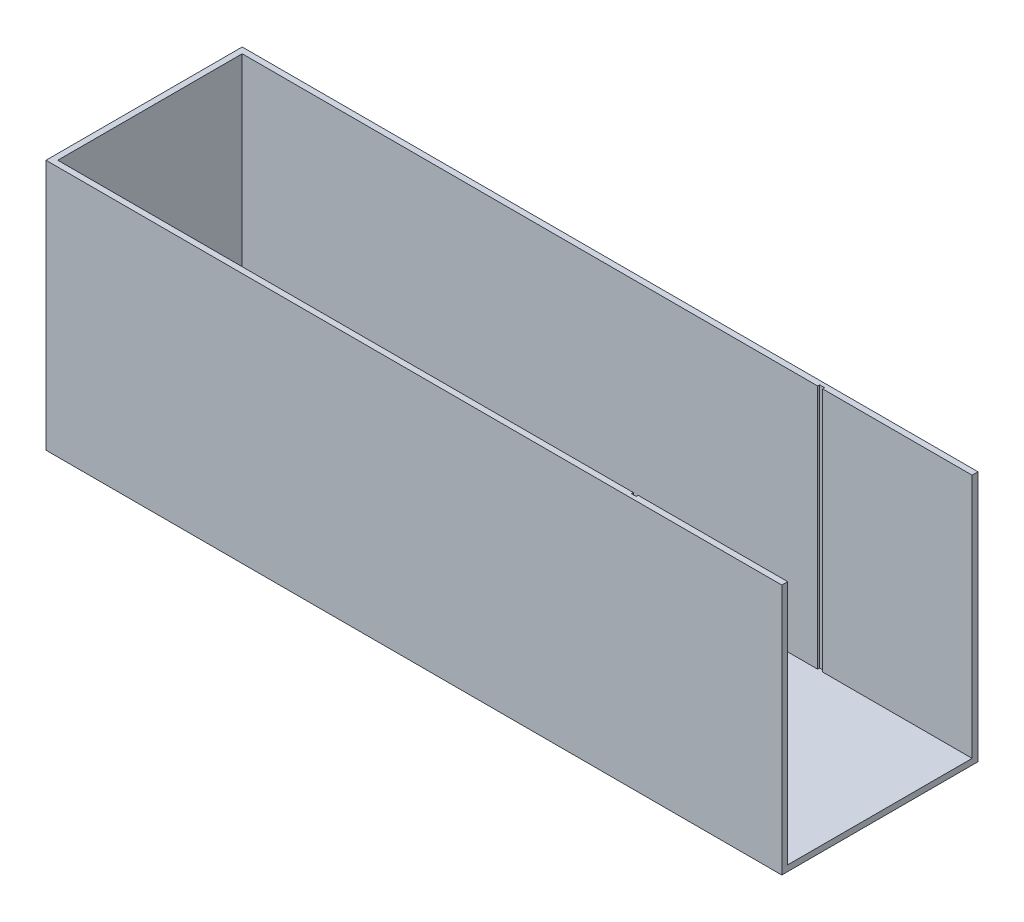
ISO-10303-21;
HEADER;
FILE_DESCRIPTION(('STEP AP214'),'2;1');
FILE_NAME('part.step','',(''),(''),'','','');
FILE_SCHEMA(('AUTOMOTIVE_DESIGN { 1 0 10303 214 1 1 1 1 }'));
ENDSEC;
DATA;
#1=APPLICATION_CONTEXT('core data for automotive mechanical design processes');
#2=APPLICATION_PROTOCOL_DEFINITION('international standard','automotive_design',2000,#1);
#3=PRODUCT_CONTEXT('',#1,'mechanical');
#4=PRODUCT('Part','Part','',(#3));
#5=PRODUCT_RELATED_PRODUCT_CATEGORY('part','',(#4));
#6=PRODUCT_DEFINITION_FORMATION('','',#4);
#7=PRODUCT_DEFINITION_CONTEXT('part definition',#1,'design');
#8=PRODUCT_DEFINITION('design','',#6,#7);
#9=PRODUCT_DEFINITION_SHAPE('','',#8);
#10=(LENGTH_UNIT() NAMED_UNIT(*) SI_UNIT(.MILLI.,.METRE.));
#11=(NAMED_UNIT(*) PLANE_ANGLE_UNIT() SI_UNIT($,.RADIAN.));
#12=(NAMED_UNIT(*) SI_UNIT($,.STERADIAN.) SOLID_ANGLE_UNIT());
#13=UNCERTAINTY_MEASURE_WITH_UNIT(LENGTH_MEASURE(1.E-05),#10,'distance_accuracy_value','');
#14=(GEOMETRIC_REPRESENTATION_CONTEXT(3) GLOBAL_UNCERTAINTY_ASSIGNED_CONTEXT((#13)) GLOBAL_UNIT_ASSIGNED_CONTEXT((#10,
#11,#12)) REPRESENTATION_CONTEXT('',''));
#15=CARTESIAN_POINT('',(0.,0.,0.));
#16=DIRECTION('',(0.,0.,1.));
#17=DIRECTION('',(1.,0.,0.));
#18=AXIS2_PLACEMENT_3D('',#15,#16,#17);
#19=CARTESIAN_POINT('',(-738.,506.,188.));
#20=DIRECTION('',(0.,0.,1.));
#21=DIRECTION('',(1.,0.,0.));
#22=AXIS2_PLACEMENT_3D('',#19,#20,#21);
#23=PLANE('',#22);
#24=DIRECTION('',(0.,-1.,0.));
#25=VECTOR('',#24,1.);
#26=CARTESIAN_POINT('',(435.2,506.,187.999999999998));
#27=LINE('',#26,#25);
#28=CARTESIAN_POINT('',(435.2,506.,187.999999999998));
#29=VERTEX_POINT('',#28);
#30=CARTESIAN_POINT('',(435.2,6.,187.999999999998));
#31=VERTEX_POINT('',#30);
#32=EDGE_CURVE('E289',#29,#31,#27,.T.);
#33=ORIENTED_EDGE('',*,*,#32,.T.);
#34=DIRECTION('',(-1.,0.,0.));
#35=VECTOR('',#34,1.);
#36=CARTESIAN_POINT('',(-738.,6.,188.));
#37=LINE('',#36,#35);
#38=CARTESIAN_POINT('',(-738.,6.,188.));
#39=VERTEX_POINT('',#38);
#40=EDGE_CURVE('E223',#31,#39,#37,.T.);
#41=ORIENTED_EDGE('',*,*,#40,.T.);
#42=DIRECTION('',(0.,-1.,0.));
#43=VECTOR('',#42,1.);
#44=CARTESIAN_POINT('',(-738.,506.,188.));
#45=LINE('',#44,#43);
#46=CARTESIAN_POINT('',(-738.,506.,188.));
#47=VERTEX_POINT('',#46);
#48=EDGE_CURVE('E232',#47,#39,#45,.T.);
#49=ORIENTED_EDGE('',*,*,#48,.F.);
#50=DIRECTION('',(-1.,0.,0.));
#51=VECTOR('',#50,1.);
#52=CARTESIAN_POINT('',(738.,506.,188.));
#53=LINE('',#52,#51);
#54=EDGE_CURVE('E215',#29,#47,#53,.T.);
#55=ORIENTED_EDGE('',*,*,#54,.F.);
#56=EDGE_LOOP('',(#33,#41,#49,#55));
#57=FACE_BOUND('',#56,.T.);
#58=ADVANCED_FACE('F32',(#57),#23,.F.);
#59=DIRECTION('',(0.,1.,0.));
#60=VECTOR('',#59,1.);
#61=CARTESIAN_POINT('',(445.2,506.,187.999999999998));
#62=LINE('',#61,#60);
#63=CARTESIAN_POINT('',(445.2,6.,187.999999999998));
#64=VERTEX_POINT('',#63);
#65=CARTESIAN_POINT('',(445.2,506.,187.999999999998));
#66=VERTEX_POINT('',#65);
#67=EDGE_CURVE('E288',#64,#66,#62,.T.);
#68=ORIENTED_EDGE('',*,*,#67,.T.);
#69=CARTESIAN_POINT('',(750.,506.,188.));
#70=VERTEX_POINT('',#69);
#71=EDGE_CURVE('E166',#70,#66,#53,.T.);
#72=ORIENTED_EDGE('',*,*,#71,.F.);
#73=DIRECTION('',(0.,-1.,0.));
#74=VECTOR('',#73,1.);
#75=CARTESIAN_POINT('',(750.,506.,188.));
#76=LINE('',#75,#74);
#77=CARTESIAN_POINT('',(750.,6.,188.));
#78=VERTEX_POINT('',#77);
#79=EDGE_CURVE('E235',#70,#78,#76,.T.);
#80=ORIENTED_EDGE('',*,*,#79,.T.);
#81=EDGE_CURVE('E224',#78,#64,#37,.T.);
#82=ORIENTED_EDGE('',*,*,#81,.T.);
#83=EDGE_LOOP('',(#68,#72,#80,#82));
#84=FACE_BOUND('',#83,.T.);
#85=ADVANCED_FACE('F287',(#84),#23,.F.);
#86=CARTESIAN_POINT('',(0.,506.,0.));
#87=DIRECTION('',(0.,1.,0.));
#88=DIRECTION('',(0.,0.,1.));
#89=AXIS2_PLACEMENT_3D('',#86,#87,#88);
#90=PLANE('',#89);
#91=DIRECTION('',(-1.,0.,0.));
#92=VECTOR('',#91,1.);
#93=CARTESIAN_POINT('',(435.2,506.,191.999999999998));
#94=LINE('',#93,#92);
#95=CARTESIAN_POINT('',(445.2,506.,191.999999999998));
#96=VERTEX_POINT('',#95);
#97=CARTESIAN_POINT('',(435.2,506.,191.999999999998));
#98=VERTEX_POINT('',#97);
#99=EDGE_CURVE('E156',#96,#98,#94,.T.);
#100=ORIENTED_EDGE('',*,*,#99,.T.);
#101=DIRECTION('',(0.,0.,-1.));
#102=VECTOR('',#101,1.);
#103=CARTESIAN_POINT('',(435.2,506.,191.999999999998));
#104=LINE('',#103,#102);
#105=EDGE_CURVE('E167',#98,#29,#104,.T.);
#106=ORIENTED_EDGE('',*,*,#105,.T.);
#107=ORIENTED_EDGE('',*,*,#54,.T.);
#108=DIRECTION('',(0.,0.,-1.));
#109=VECTOR('',#108,1.);
#110=CARTESIAN_POINT('',(-738.,506.,-188.));
#111=LINE('',#110,#109);
#112=CARTESIAN_POINT('',(-738.,506.,-188.));
#113=VERTEX_POINT('',#112);
#114=EDGE_CURVE('E217',#47,#113,#111,.T.);
#115=ORIENTED_EDGE('',*,*,#114,.T.);
#116=DIRECTION('',(1.,0.,0.));
#117=VECTOR('',#116,1.);
#118=CARTESIAN_POINT('',(738.,506.,-188.));
#119=LINE('',#118,#117);
#120=CARTESIAN_POINT('',(435.2,506.,-187.999999999998));
#121=VERTEX_POINT('',#120);
#122=EDGE_CURVE('E197',#113,#121,#119,.T.);
#123=ORIENTED_EDGE('',*,*,#122,.T.);
#124=DIRECTION('',(0.,0.,1.));
#125=VECTOR('',#124,1.);
#126=CARTESIAN_POINT('',(435.2,506.,-191.999999999998));
#127=LINE('',#126,#125);
#128=CARTESIAN_POINT('',(435.2,506.,-191.999999999998));
#129=VERTEX_POINT('',#128);
#130=EDGE_CURVE('E188',#129,#121,#127,.T.);
#131=ORIENTED_EDGE('',*,*,#130,.F.);
#132=DIRECTION('',(-1.,0.,0.));
#133=VECTOR('',#132,1.);
#134=CARTESIAN_POINT('',(435.2,506.,-191.999999999998));
#135=LINE('',#134,#133);
#136=CARTESIAN_POINT('',(445.2,506.,-191.999999999998));
#137=VERTEX_POINT('',#136);
#138=EDGE_CURVE('E181',#137,#129,#135,.T.);
#139=ORIENTED_EDGE('',*,*,#138,.F.);
#140=DIRECTION('',(0.,0.,1.));
#141=VECTOR('',#140,1.);
#142=CARTESIAN_POINT('',(445.2,506.,-191.999999999998));
#143=LINE('',#142,#141);
#144=CARTESIAN_POINT('',(445.2,506.,-187.999999999998));
#145=VERTEX_POINT('',#144);
#146=EDGE_CURVE('E191',#137,#145,#143,.T.);
#147=ORIENTED_EDGE('',*,*,#146,.T.);
#148=CARTESIAN_POINT('',(750.,506.,-188.));
#149=VERTEX_POINT('',#148);
#150=EDGE_CURVE('E201',#145,#149,#119,.T.);
#151=ORIENTED_EDGE('',*,*,#150,.T.);
#152=DIRECTION('',(0.,0.,-1.));
#153=VECTOR('',#152,1.);
#154=CARTESIAN_POINT('',(750.,506.,-188.));
#155=LINE('',#154,#153);
#156=CARTESIAN_POINT('',(750.,506.,-200.));
#157=VERTEX_POINT('',#156);
#158=EDGE_CURVE('E200',#149,#157,#155,.T.);
#159=ORIENTED_EDGE('',*,*,#158,.T.);
#160=DIRECTION('',(-1.,0.,0.));
#161=VECTOR('',#160,1.);
#162=CARTESIAN_POINT('',(750.,506.,-200.));
#163=LINE('',#162,#161);
#164=CARTESIAN_POINT('',(-750.,506.,-200.));
#165=VERTEX_POINT('',#164);
#166=EDGE_CURVE('E204',#157,#165,#163,.T.);
#167=ORIENTED_EDGE('',*,*,#166,.T.);
#168=DIRECTION('',(0.,0.,1.));
#169=VECTOR('',#168,1.);
#170=CARTESIAN_POINT('',(-750.,506.,-200.));
#171=LINE('',#170,#169);
#172=CARTESIAN_POINT('',(-750.,506.,200.));
#173=VERTEX_POINT('',#172);
#174=EDGE_CURVE('E207',#165,#173,#171,.T.);
#175=ORIENTED_EDGE('',*,*,#174,.T.);
#176=DIRECTION('',(1.,0.,0.));
#177=VECTOR('',#176,1.);
#178=CARTESIAN_POINT('',(-750.,506.,200.));
#179=LINE('',#178,#177);
#180=CARTESIAN_POINT('',(750.,506.,200.));
#181=VERTEX_POINT('',#180);
#182=EDGE_CURVE('E210',#173,#181,#179,.T.);
#183=ORIENTED_EDGE('',*,*,#182,.T.);
#184=DIRECTION('',(0.,0.,-1.));
#185=VECTOR('',#184,1.);
#186=CARTESIAN_POINT('',(750.,506.,188.));
#187=LINE('',#186,#185);
#188=EDGE_CURVE('E213',#181,#70,#187,.T.);
#189=ORIENTED_EDGE('',*,*,#188,.T.);
#190=ORIENTED_EDGE('',*,*,#71,.T.);
#191=DIRECTION('',(0.,0.,-1.));
#192=VECTOR('',#191,1.);
#193=CARTESIAN_POINT('',(445.2,506.,191.999999999998));
#194=LINE('',#193,#192);
#195=EDGE_CURVE('E152',#96,#66,#194,.T.);
#196=ORIENTED_EDGE('',*,*,#195,.F.);
#197=EDGE_LOOP('',(#100,#106,#107,#115,#123,#131,#139,#147,#151,#159,#167,#175,#183,#189,#190,#196));
#198=FACE_BOUND('',#197,.T.);
#199=ADVANCED_FACE('F164',(#198),#90,.T.);
#200=CARTESIAN_POINT('',(738.,506.,-188.));
#201=DIRECTION('',(0.,0.,-1.));
#202=DIRECTION('',(-1.,0.,0.));
#203=AXIS2_PLACEMENT_3D('',#200,#201,#202);
#204=PLANE('',#203);
#205=DIRECTION('',(1.,0.,0.));
#206=VECTOR('',#205,1.);
#207=CARTESIAN_POINT('',(738.,6.,-188.));
#208=LINE('',#207,#206);
#209=CARTESIAN_POINT('',(-738.,6.,-188.));
#210=VERTEX_POINT('',#209);
#211=CARTESIAN_POINT('',(435.2,6.,-187.999999999998));
#212=VERTEX_POINT('',#211);
#213=EDGE_CURVE('E220',#210,#212,#208,.T.);
#214=ORIENTED_EDGE('',*,*,#213,.T.);
#215=DIRECTION('',(0.,-1.,0.));
#216=VECTOR('',#215,1.);
#217=CARTESIAN_POINT('',(435.2,506.,-187.999999999998));
#218=LINE('',#217,#216);
#219=EDGE_CURVE('E184',#121,#212,#218,.T.);
#220=ORIENTED_EDGE('',*,*,#219,.F.);
#221=ORIENTED_EDGE('',*,*,#122,.F.);
#222=DIRECTION('',(0.,-1.,0.));
#223=VECTOR('',#222,1.);
#224=CARTESIAN_POINT('',(-738.,506.,-188.));
#225=LINE('',#224,#223);
#226=EDGE_CURVE('E219',#113,#210,#225,.T.);
#227=ORIENTED_EDGE('',*,*,#226,.T.);
#228=EDGE_LOOP('',(#214,#220,#221,#227));
#229=FACE_BOUND('',#228,.T.);
#230=ADVANCED_FACE('F312',(#229),#204,.F.);
#231=CARTESIAN_POINT('',(0.,6.,0.));
#232=DIRECTION('',(0.,-1.,0.));
#233=DIRECTION('',(0.,0.,-1.));
#234=AXIS2_PLACEMENT_3D('',#231,#232,#233);
#235=PLANE('',#234);
#236=ORIENTED_EDGE('',*,*,#213,.F.);
#237=DIRECTION('',(0.,0.,-1.));
#238=VECTOR('',#237,1.);
#239=CARTESIAN_POINT('',(-738.,6.,-188.));
#240=LINE('',#239,#238);
#241=EDGE_CURVE('E227',#39,#210,#240,.T.);
#242=ORIENTED_EDGE('',*,*,#241,.F.);
#243=ORIENTED_EDGE('',*,*,#40,.F.);
#244=DIRECTION('',(0.,0.,-1.));
#245=VECTOR('',#244,1.);
#246=CARTESIAN_POINT('',(435.2,6.,191.999999999998));
#247=LINE('',#246,#245);
#248=CARTESIAN_POINT('',(435.2,6.,191.999999999998));
#249=VERTEX_POINT('',#248);
#250=EDGE_CURVE('E169',#249,#31,#247,.T.);
#251=ORIENTED_EDGE('',*,*,#250,.F.);
#252=DIRECTION('',(1.,0.,0.));
#253=VECTOR('',#252,1.);
#254=CARTESIAN_POINT('',(435.2,6.,191.999999999998));
#255=LINE('',#254,#253);
#256=CARTESIAN_POINT('',(445.2,6.,191.999999999998));
#257=VERTEX_POINT('',#256);
#258=EDGE_CURVE('E155',#249,#257,#255,.T.);
#259=ORIENTED_EDGE('',*,*,#258,.T.);
#260=DIRECTION('',(0.,0.,-1.));
#261=VECTOR('',#260,1.);
#262=CARTESIAN_POINT('',(445.2,6.,191.999999999998));
#263=LINE('',#262,#261);
#264=EDGE_CURVE('E154',#257,#64,#263,.T.);
#265=ORIENTED_EDGE('',*,*,#264,.T.);
#266=ORIENTED_EDGE('',*,*,#81,.F.);
#267=DIRECTION('',(0.,0.,-1.));
#268=VECTOR('',#267,1.);
#269=CARTESIAN_POINT('',(750.,6.,200.));
#270=LINE('',#269,#268);
#271=CARTESIAN_POINT('',(750.,6.,-188.));
#272=VERTEX_POINT('',#271);
#273=EDGE_CURVE('E242',#78,#272,#270,.T.);
#274=ORIENTED_EDGE('',*,*,#273,.T.);
#275=CARTESIAN_POINT('',(445.2,6.,-187.999999999998));
#276=VERTEX_POINT('',#275);
#277=EDGE_CURVE('E190',#276,#272,#208,.T.);
#278=ORIENTED_EDGE('',*,*,#277,.F.);
#279=DIRECTION('',(0.,0.,1.));
#280=VECTOR('',#279,1.);
#281=CARTESIAN_POINT('',(445.2,6.,-191.999999999998));
#282=LINE('',#281,#280);
#283=CARTESIAN_POINT('',(445.2,6.,-191.999999999998));
#284=VERTEX_POINT('',#283);
#285=EDGE_CURVE('E194',#284,#276,#282,.T.);
#286=ORIENTED_EDGE('',*,*,#285,.F.);
#287=DIRECTION('',(1.,0.,0.));
#288=VECTOR('',#287,1.);
#289=CARTESIAN_POINT('',(435.2,6.,-191.999999999998));
#290=LINE('',#289,#288);
#291=CARTESIAN_POINT('',(435.2,6.,-191.999999999998));
#292=VERTEX_POINT('',#291);
#293=EDGE_CURVE('E177',#292,#284,#290,.T.);
#294=ORIENTED_EDGE('',*,*,#293,.F.);
#295=DIRECTION('',(0.,0.,1.));
#296=VECTOR('',#295,1.);
#297=CARTESIAN_POINT('',(435.2,6.,-191.999999999998));
#298=LINE('',#297,#296);
#299=EDGE_CURVE('E183',#292,#212,#298,.T.);
#300=ORIENTED_EDGE('',*,*,#299,.T.);
#301=EDGE_LOOP('',(#236,#242,#243,#251,#259,#265,#266,#274,#278,#286,#294,#300));
#302=FACE_BOUND('',#301,.T.);
#303=ADVANCED_FACE('F285',(#302),#235,.F.);
#304=CARTESIAN_POINT('',(750.,6.,200.));
#305=DIRECTION('',(-1.,0.,0.));
#306=DIRECTION('',(0.,0.,1.));
#307=AXIS2_PLACEMENT_3D('',#304,#305,#306);
#308=PLANE('',#307);
#309=DIRECTION('',(0.,0.,-1.));
#310=VECTOR('',#309,1.);
#311=CARTESIAN_POINT('',(750.,-6.,200.));
#312=LINE('',#311,#310);
#313=CARTESIAN_POINT('',(750.,-6.,200.));
#314=VERTEX_POINT('',#313);
#315=CARTESIAN_POINT('',(750.,-6.,-200.));
#316=VERTEX_POINT('',#315);
#317=EDGE_CURVE('E241',#314,#316,#312,.T.);
#318=ORIENTED_EDGE('',*,*,#317,.T.);
#319=DIRECTION('',(0.,-1.,0.));
#320=VECTOR('',#319,1.);
#321=CARTESIAN_POINT('',(750.,6.,-200.));
#322=LINE('',#321,#320);
#323=EDGE_CURVE('E11',#157,#316,#322,.T.);
#324=ORIENTED_EDGE('',*,*,#323,.F.);
#325=ORIENTED_EDGE('',*,*,#158,.F.);
#326=DIRECTION('',(0.,-1.,0.));
#327=VECTOR('',#326,1.);
#328=CARTESIAN_POINT('',(750.,506.,-188.));
#329=LINE('',#328,#327);
#330=EDGE_CURVE('E238',#149,#272,#329,.T.);
#331=ORIENTED_EDGE('',*,*,#330,.T.);
#332=ORIENTED_EDGE('',*,*,#273,.F.);
#333=ORIENTED_EDGE('',*,*,#79,.F.);
#334=ORIENTED_EDGE('',*,*,#188,.F.);
#335=DIRECTION('',(0.,-1.,0.));
#336=VECTOR('',#335,1.);
#337=CARTESIAN_POINT('',(750.,6.,200.));
#338=LINE('',#337,#336);
#339=EDGE_CURVE('E245',#181,#314,#338,.T.);
#340=ORIENTED_EDGE('',*,*,#339,.T.);
#341=EDGE_LOOP('',(#318,#324,#325,#331,#332,#333,#334,#340));
#342=FACE_BOUND('',#341,.T.);
#343=ADVANCED_FACE('F34',(#342),#308,.F.);
#344=CARTESIAN_POINT('',(-750.,6.,-200.));
#345=DIRECTION('',(0.,0.,1.));
#346=DIRECTION('',(1.,0.,0.));
#347=AXIS2_PLACEMENT_3D('',#344,#345,#346);
#348=PLANE('',#347);
#349=DIRECTION('',(-1.,0.,0.));
#350=VECTOR('',#349,1.);
#351=CARTESIAN_POINT('',(-750.,-6.,-200.));
#352=LINE('',#351,#350);
#353=CARTESIAN_POINT('',(-750.,-6.,-200.));
#354=VERTEX_POINT('',#353);
#355=EDGE_CURVE('E249',#316,#354,#352,.T.);
#356=ORIENTED_EDGE('',*,*,#355,.T.);
#357=DIRECTION('',(0.,-1.,0.));
#358=VECTOR('',#357,1.);
#359=CARTESIAN_POINT('',(-750.,6.,-200.));
#360=LINE('',#359,#358);
#361=EDGE_CURVE('E40',#165,#354,#360,.T.);
#362=ORIENTED_EDGE('',*,*,#361,.F.);
#363=ORIENTED_EDGE('',*,*,#166,.F.);
#364=ORIENTED_EDGE('',*,*,#323,.T.);
#365=EDGE_LOOP('',(#356,#362,#363,#364));
#366=FACE_BOUND('',#365,.T.);
#367=ADVANCED_FACE('F277',(#366),#348,.F.);
#368=CARTESIAN_POINT('',(-750.,6.,200.));
#369=DIRECTION('',(1.,0.,0.));
#370=DIRECTION('',(0.,0.,-1.));
#371=AXIS2_PLACEMENT_3D('',#368,#369,#370);
#372=PLANE('',#371);
#373=DIRECTION('',(0.,0.,1.));
#374=VECTOR('',#373,1.);
#375=CARTESIAN_POINT('',(-750.,-6.,200.));
#376=LINE('',#375,#374);
#377=CARTESIAN_POINT('',(-750.,-6.,200.));
#378=VERTEX_POINT('',#377);
#379=EDGE_CURVE('E251',#354,#378,#376,.T.);
#380=ORIENTED_EDGE('',*,*,#379,.T.);
#381=DIRECTION('',(0.,-1.,0.));
#382=VECTOR('',#381,1.);
#383=CARTESIAN_POINT('',(-750.,6.,200.));
#384=LINE('',#383,#382);
#385=EDGE_CURVE('E256',#173,#378,#384,.T.);
#386=ORIENTED_EDGE('',*,*,#385,.F.);
#387=ORIENTED_EDGE('',*,*,#174,.F.);
#388=ORIENTED_EDGE('',*,*,#361,.T.);
#389=EDGE_LOOP('',(#380,#386,#387,#388));
#390=FACE_BOUND('',#389,.T.);
#391=ADVANCED_FACE('F262',(#390),#372,.F.);
#392=CARTESIAN_POINT('',(-750.,6.,200.));
#393=DIRECTION('',(0.,0.,-1.));
#394=DIRECTION('',(-1.,0.,0.));
#395=AXIS2_PLACEMENT_3D('',#392,#393,#394);
#396=PLANE('',#395);
#397=DIRECTION('',(1.,0.,0.));
#398=VECTOR('',#397,1.);
#399=CARTESIAN_POINT('',(-750.,-6.,200.));
#400=LINE('',#399,#398);
#401=EDGE_CURVE('E246',#378,#314,#400,.T.);
#402=ORIENTED_EDGE('',*,*,#401,.T.);
#403=ORIENTED_EDGE('',*,*,#339,.F.);
#404=ORIENTED_EDGE('',*,*,#182,.F.);
#405=ORIENTED_EDGE('',*,*,#385,.T.);
#406=EDGE_LOOP('',(#402,#403,#404,#405));
#407=FACE_BOUND('',#406,.T.);
#408=ADVANCED_FACE('F270',(#407),#396,.F.);
#409=CARTESIAN_POINT('',(0.,-6.,0.));
#410=DIRECTION('',(0.,-1.,0.));
#411=DIRECTION('',(0.,0.,-1.));
#412=AXIS2_PLACEMENT_3D('',#409,#410,#411);
#413=PLANE('',#412);
#414=ORIENTED_EDGE('',*,*,#317,.F.);
#415=ORIENTED_EDGE('',*,*,#401,.F.);
#416=ORIENTED_EDGE('',*,*,#379,.F.);
#417=ORIENTED_EDGE('',*,*,#355,.F.);
#418=EDGE_LOOP('',(#414,#415,#416,#417));
#419=FACE_BOUND('',#418,.T.);
#420=ADVANCED_FACE('F268',(#419),#413,.T.);
#421=ORIENTED_EDGE('',*,*,#150,.F.);
#422=DIRECTION('',(0.,1.,0.));
#423=VECTOR('',#422,1.);
#424=CARTESIAN_POINT('',(445.2,506.,-187.999999999998));
#425=LINE('',#424,#423);
#426=EDGE_CURVE('E178',#276,#145,#425,.T.);
#427=ORIENTED_EDGE('',*,*,#426,.F.);
#428=ORIENTED_EDGE('',*,*,#277,.T.);
#429=ORIENTED_EDGE('',*,*,#330,.F.);
#430=EDGE_LOOP('',(#421,#427,#428,#429));
#431=FACE_BOUND('',#430,.T.);
#432=ADVANCED_FACE('F281',(#431),#204,.F.);
#433=CARTESIAN_POINT('',(-738.,506.,-188.));
#434=DIRECTION('',(-1.,0.,0.));
#435=DIRECTION('',(0.,0.,1.));
#436=AXIS2_PLACEMENT_3D('',#433,#434,#435);
#437=PLANE('',#436);
#438=ORIENTED_EDGE('',*,*,#241,.T.);
#439=ORIENTED_EDGE('',*,*,#226,.F.);
#440=ORIENTED_EDGE('',*,*,#114,.F.);
#441=ORIENTED_EDGE('',*,*,#48,.T.);
#442=EDGE_LOOP('',(#438,#439,#440,#441));
#443=FACE_BOUND('',#442,.T.);
#444=ADVANCED_FACE('F306',(#443),#437,.F.);
#445=CARTESIAN_POINT('',(435.2,506.,-191.999999999998));
#446=DIRECTION('',(-1.,0.,0.));
#447=DIRECTION('',(0.,-1.,0.));
#448=AXIS2_PLACEMENT_3D('',#445,#446,#447);
#449=PLANE('',#448);
#450=ORIENTED_EDGE('',*,*,#219,.T.);
#451=ORIENTED_EDGE('',*,*,#299,.F.);
#452=DIRECTION('',(0.,-1.,0.));
#453=VECTOR('',#452,1.);
#454=CARTESIAN_POINT('',(435.2,506.,-191.999999999998));
#455=LINE('',#454,#453);
#456=EDGE_CURVE('E174',#129,#292,#455,.T.);
#457=ORIENTED_EDGE('',*,*,#456,.F.);
#458=ORIENTED_EDGE('',*,*,#130,.T.);
#459=EDGE_LOOP('',(#450,#451,#457,#458));
#460=FACE_BOUND('',#459,.T.);
#461=ADVANCED_FACE('F314',(#460),#449,.F.);
#462=CARTESIAN_POINT('',(445.2,506.,-191.999999999998));
#463=DIRECTION('',(1.,0.,0.));
#464=DIRECTION('',(0.,1.,0.));
#465=AXIS2_PLACEMENT_3D('',#462,#463,#464);
#466=PLANE('',#465);
#467=ORIENTED_EDGE('',*,*,#426,.T.);
#468=ORIENTED_EDGE('',*,*,#146,.F.);
#469=DIRECTION('',(0.,1.,0.));
#470=VECTOR('',#469,1.);
#471=CARTESIAN_POINT('',(445.2,506.,-191.999999999998));
#472=LINE('',#471,#470);
#473=EDGE_CURVE('E55',#284,#137,#472,.T.);
#474=ORIENTED_EDGE('',*,*,#473,.F.);
#475=ORIENTED_EDGE('',*,*,#285,.T.);
#476=EDGE_LOOP('',(#467,#468,#474,#475));
#477=FACE_BOUND('',#476,.T.);
#478=ADVANCED_FACE('F318',(#477),#466,.F.);
#479=CARTESIAN_POINT('',(0.,0.,-191.999999999998));
#480=DIRECTION('',(0.,0.,1.));
#481=DIRECTION('',(1.,0.,0.));
#482=AXIS2_PLACEMENT_3D('',#479,#480,#481);
#483=PLANE('',#482);
#484=ORIENTED_EDGE('',*,*,#456,.T.);
#485=ORIENTED_EDGE('',*,*,#293,.T.);
#486=ORIENTED_EDGE('',*,*,#473,.T.);
#487=ORIENTED_EDGE('',*,*,#138,.T.);
#488=EDGE_LOOP('',(#484,#485,#486,#487));
#489=FACE_BOUND('',#488,.T.);
#490=ADVANCED_FACE('F316',(#489),#483,.T.);
#491=CARTESIAN_POINT('',(435.2,506.,191.999999999998));
#492=DIRECTION('',(1.,0.,0.));
#493=DIRECTION('',(0.,1.,0.));
#494=AXIS2_PLACEMENT_3D('',#491,#492,#493);
#495=PLANE('',#494);
#496=ORIENTED_EDGE('',*,*,#32,.F.);
#497=ORIENTED_EDGE('',*,*,#105,.F.);
#498=DIRECTION('',(0.,-1.,0.));
#499=VECTOR('',#498,1.);
#500=CARTESIAN_POINT('',(435.2,506.,191.999999999998));
#501=LINE('',#500,#499);
#502=EDGE_CURVE('E47',#98,#249,#501,.T.);
#503=ORIENTED_EDGE('',*,*,#502,.T.);
#504=ORIENTED_EDGE('',*,*,#250,.T.);
#505=EDGE_LOOP('',(#496,#497,#503,#504));
#506=FACE_BOUND('',#505,.T.);
#507=ADVANCED_FACE('F297',(#506),#495,.T.);
#508=CARTESIAN_POINT('',(445.2,506.,191.999999999998));
#509=DIRECTION('',(-1.,0.,0.));
#510=DIRECTION('',(0.,-1.,0.));
#511=AXIS2_PLACEMENT_3D('',#508,#509,#510);
#512=PLANE('',#511);
#513=ORIENTED_EDGE('',*,*,#67,.F.);
#514=ORIENTED_EDGE('',*,*,#264,.F.);
#515=DIRECTION('',(0.,1.,0.));
#516=VECTOR('',#515,1.);
#517=CARTESIAN_POINT('',(445.2,506.,191.999999999998));
#518=LINE('',#517,#516);
#519=EDGE_CURVE('E148',#257,#96,#518,.T.);
#520=ORIENTED_EDGE('',*,*,#519,.T.);
#521=ORIENTED_EDGE('',*,*,#195,.T.);
#522=EDGE_LOOP('',(#513,#514,#520,#521));
#523=FACE_BOUND('',#522,.T.);
#524=ADVANCED_FACE('F150',(#523),#512,.T.);
#525=CARTESIAN_POINT('',(0.,0.,191.999999999998));
#526=DIRECTION('',(0.,0.,-1.));
#527=DIRECTION('',(1.,0.,0.));
#528=AXIS2_PLACEMENT_3D('',#525,#526,#527);
#529=PLANE('',#528);
#530=ORIENTED_EDGE('',*,*,#502,.F.);
#531=ORIENTED_EDGE('',*,*,#99,.F.);
#532=ORIENTED_EDGE('',*,*,#519,.F.);
#533=ORIENTED_EDGE('',*,*,#258,.F.);
#534=EDGE_LOOP('',(#530,#531,#532,#533));
#535=FACE_BOUND('',#534,.T.);
#536=ADVANCED_FACE('F159',(#535),#529,.T.);
#537=CLOSED_SHELL('',(#58,#85,#199,#230,#303,#343,#367,#391,#408,#420,#432,#444,#461,#478,#490,
#507,#524,#536));
#538=MANIFOLD_SOLID_BREP('B2',#537);
#539=ADVANCED_BREP_SHAPE_REPRESENTATION('',(#18,#538),#14);
#540=SHAPE_DEFINITION_REPRESENTATION(#9,#539);
ENDSEC;
END-ISO-10303-21;
